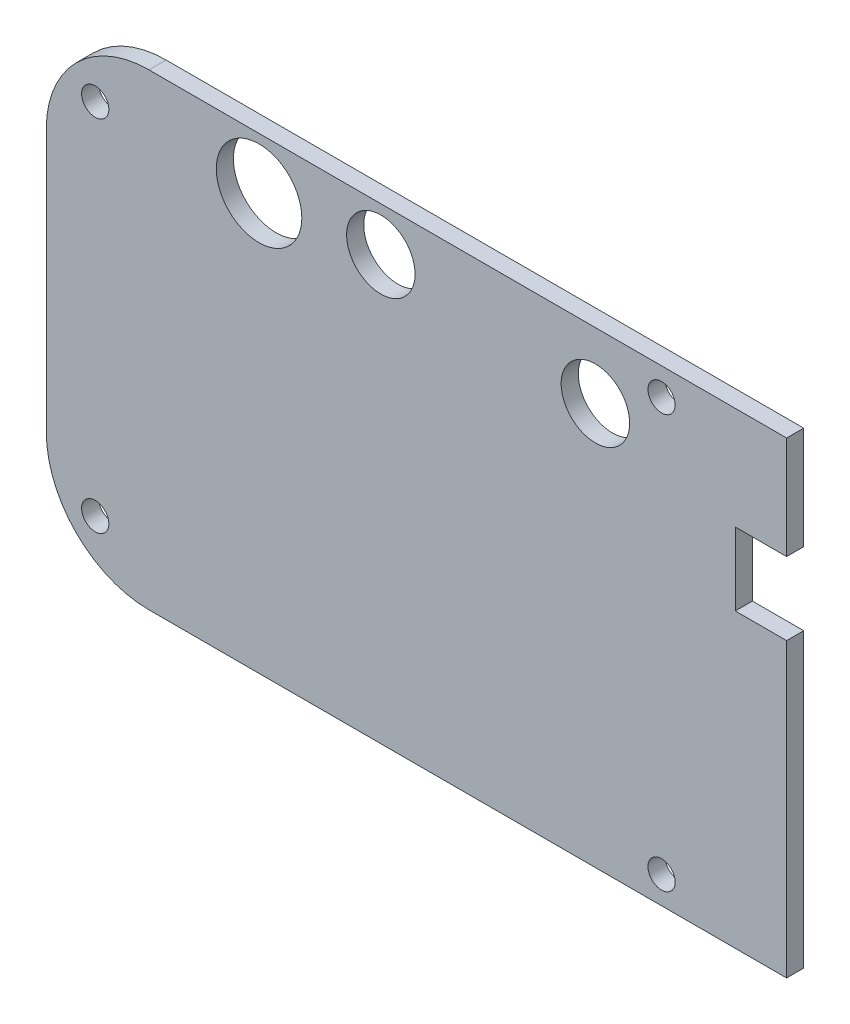
ISO-10303-21;
HEADER;
FILE_DESCRIPTION(('STEP AP214'),'2;1');
FILE_NAME('part.step','',(''),(''),'','','');
FILE_SCHEMA(('AUTOMOTIVE_DESIGN { 1 0 10303 214 1 1 1 1 }'));
ENDSEC;
DATA;
#1=APPLICATION_CONTEXT('core data for automotive mechanical design processes');
#2=APPLICATION_PROTOCOL_DEFINITION('international standard','automotive_design',2000,#1);
#3=PRODUCT_CONTEXT('',#1,'mechanical');
#4=PRODUCT('Part','Part','',(#3));
#5=PRODUCT_RELATED_PRODUCT_CATEGORY('part','',(#4));
#6=PRODUCT_DEFINITION_FORMATION('','',#4);
#7=PRODUCT_DEFINITION_CONTEXT('part definition',#1,'design');
#8=PRODUCT_DEFINITION('design','',#6,#7);
#9=PRODUCT_DEFINITION_SHAPE('','',#8);
#10=(LENGTH_UNIT() NAMED_UNIT(*) SI_UNIT(.MILLI.,.METRE.));
#11=(NAMED_UNIT(*) PLANE_ANGLE_UNIT() SI_UNIT($,.RADIAN.));
#12=(NAMED_UNIT(*) SI_UNIT($,.STERADIAN.) SOLID_ANGLE_UNIT());
#13=UNCERTAINTY_MEASURE_WITH_UNIT(LENGTH_MEASURE(1.E-05),#10,'distance_accuracy_value','');
#14=(GEOMETRIC_REPRESENTATION_CONTEXT(3) GLOBAL_UNCERTAINTY_ASSIGNED_CONTEXT((#13)) GLOBAL_UNIT_ASSIGNED_CONTEXT((#10,
#11,#12)) REPRESENTATION_CONTEXT('',''));
#15=CARTESIAN_POINT('',(0.,0.,0.));
#16=DIRECTION('',(0.,0.,1.));
#17=DIRECTION('',(1.,0.,0.));
#18=AXIS2_PLACEMENT_3D('',#15,#16,#17);
#19=CARTESIAN_POINT('',(86.5,0.,2.));
#20=DIRECTION('',(-1.,0.,0.));
#21=DIRECTION('',(0.,0.,1.));
#22=AXIS2_PLACEMENT_3D('',#19,#20,#21);
#23=PLANE('',#22);
#24=DIRECTION('',(0.,1.,0.));
#25=VECTOR('',#24,1.);
#26=CARTESIAN_POINT('',(86.5,0.,0.));
#27=LINE('',#26,#25);
#28=CARTESIAN_POINT('',(86.5,0.,0.));
#29=VERTEX_POINT('',#28);
#30=CARTESIAN_POINT('',(86.5,34.14,0.));
#31=VERTEX_POINT('',#30);
#32=EDGE_CURVE('E162',#29,#31,#27,.T.);
#33=ORIENTED_EDGE('',*,*,#32,.T.);
#34=DIRECTION('',(0.,0.,1.));
#35=VECTOR('',#34,1.);
#36=CARTESIAN_POINT('',(86.5,34.14,-8.));
#37=LINE('',#36,#35);
#38=CARTESIAN_POINT('',(86.5,34.14,2.));
#39=VERTEX_POINT('',#38);
#40=EDGE_CURVE('E251',#31,#39,#37,.T.);
#41=ORIENTED_EDGE('',*,*,#40,.T.);
#42=DIRECTION('',(0.,1.,0.));
#43=VECTOR('',#42,1.);
#44=CARTESIAN_POINT('',(86.5,0.,2.));
#45=LINE('',#44,#43);
#46=CARTESIAN_POINT('',(86.5,0.,2.));
#47=VERTEX_POINT('',#46);
#48=EDGE_CURVE('E145',#47,#39,#45,.T.);
#49=ORIENTED_EDGE('',*,*,#48,.F.);
#50=DIRECTION('',(0.,0.,-1.));
#51=VECTOR('',#50,1.);
#52=CARTESIAN_POINT('',(86.5,0.,2.));
#53=LINE('',#52,#51);
#54=EDGE_CURVE('E161',#47,#29,#53,.T.);
#55=ORIENTED_EDGE('',*,*,#54,.T.);
#56=EDGE_LOOP('',(#33,#41,#49,#55));
#57=FACE_BOUND('',#56,.T.);
#58=ADVANCED_FACE('F40',(#57),#23,.F.);
#59=CARTESIAN_POINT('',(86.5,42.64,2.));
#60=VERTEX_POINT('',#59);
#61=CARTESIAN_POINT('',(86.5,54.64,2.));
#62=VERTEX_POINT('',#61);
#63=EDGE_CURVE('E136',#60,#62,#45,.T.);
#64=ORIENTED_EDGE('',*,*,#63,.F.);
#65=DIRECTION('',(0.,0.,1.));
#66=VECTOR('',#65,1.);
#67=CARTESIAN_POINT('',(86.5,42.64,-8.));
#68=LINE('',#67,#66);
#69=CARTESIAN_POINT('',(86.5,42.64,0.));
#70=VERTEX_POINT('',#69);
#71=EDGE_CURVE('E119',#70,#60,#68,.T.);
#72=ORIENTED_EDGE('',*,*,#71,.F.);
#73=CARTESIAN_POINT('',(86.5,54.64,0.));
#74=VERTEX_POINT('',#73);
#75=EDGE_CURVE('E166',#70,#74,#27,.T.);
#76=ORIENTED_EDGE('',*,*,#75,.T.);
#77=DIRECTION('',(0.,0.,-1.));
#78=VECTOR('',#77,1.);
#79=CARTESIAN_POINT('',(86.5,54.64,2.));
#80=LINE('',#79,#78);
#81=EDGE_CURVE('E144',#62,#74,#80,.T.);
#82=ORIENTED_EDGE('',*,*,#81,.F.);
#83=EDGE_LOOP('',(#64,#72,#76,#82));
#84=FACE_BOUND('',#83,.T.);
#85=ADVANCED_FACE('F142',(#84),#23,.F.);
#86=CARTESIAN_POINT('',(86.5,54.64,2.));
#87=DIRECTION('',(0.,-1.,0.));
#88=DIRECTION('',(1.,0.,0.));
#89=AXIS2_PLACEMENT_3D('',#86,#87,#88);
#90=PLANE('',#89);
#91=DIRECTION('',(-1.,0.,0.));
#92=VECTOR('',#91,1.);
#93=CARTESIAN_POINT('',(86.5,54.64,0.));
#94=LINE('',#93,#92);
#95=CARTESIAN_POINT('',(12.,54.64,0.));
#96=VERTEX_POINT('',#95);
#97=EDGE_CURVE('E165',#74,#96,#94,.T.);
#98=ORIENTED_EDGE('',*,*,#97,.T.);
#99=DIRECTION('',(0.,0.,-1.));
#100=VECTOR('',#99,1.);
#101=CARTESIAN_POINT('',(12.,54.64,2.));
#102=LINE('',#101,#100);
#103=CARTESIAN_POINT('',(12.,54.64,2.));
#104=VERTEX_POINT('',#103);
#105=EDGE_CURVE('E178',#96,#104,#102,.F.);
#106=ORIENTED_EDGE('',*,*,#105,.T.);
#107=DIRECTION('',(-1.,0.,0.));
#108=VECTOR('',#107,1.);
#109=CARTESIAN_POINT('',(86.5,54.64,2.));
#110=LINE('',#109,#108);
#111=EDGE_CURVE('E149',#62,#104,#110,.T.);
#112=ORIENTED_EDGE('',*,*,#111,.F.);
#113=ORIENTED_EDGE('',*,*,#81,.T.);
#114=EDGE_LOOP('',(#98,#106,#112,#113));
#115=FACE_BOUND('',#114,.T.);
#116=ADVANCED_FACE('F300',(#115),#90,.F.);
#117=CARTESIAN_POINT('',(0.,54.64,2.));
#118=DIRECTION('',(1.,0.,0.));
#119=DIRECTION('',(0.,0.,-1.));
#120=AXIS2_PLACEMENT_3D('',#117,#118,#119);
#121=PLANE('',#120);
#122=DIRECTION('',(0.,-1.,0.));
#123=VECTOR('',#122,1.);
#124=CARTESIAN_POINT('',(0.,54.64,0.));
#125=LINE('',#124,#123);
#126=CARTESIAN_POINT('',(0.,42.64,0.));
#127=VERTEX_POINT('',#126);
#128=CARTESIAN_POINT('',(0.,12.,0.));
#129=VERTEX_POINT('',#128);
#130=EDGE_CURVE('E150',#127,#129,#125,.T.);
#131=ORIENTED_EDGE('',*,*,#130,.T.);
#132=DIRECTION('',(0.,0.,-1.));
#133=VECTOR('',#132,1.);
#134=CARTESIAN_POINT('',(0.,12.,2.));
#135=LINE('',#134,#133);
#136=CARTESIAN_POINT('',(0.,12.,2.));
#137=VERTEX_POINT('',#136);
#138=EDGE_CURVE('E65',#129,#137,#135,.F.);
#139=ORIENTED_EDGE('',*,*,#138,.T.);
#140=DIRECTION('',(0.,-1.,0.));
#141=VECTOR('',#140,1.);
#142=CARTESIAN_POINT('',(0.,54.64,2.));
#143=LINE('',#142,#141);
#144=CARTESIAN_POINT('',(0.,42.64,2.));
#145=VERTEX_POINT('',#144);
#146=EDGE_CURVE('E157',#145,#137,#143,.T.);
#147=ORIENTED_EDGE('',*,*,#146,.F.);
#148=DIRECTION('',(0.,0.,-1.));
#149=VECTOR('',#148,1.);
#150=CARTESIAN_POINT('',(0.,42.64,2.));
#151=LINE('',#150,#149);
#152=EDGE_CURVE('E173',#145,#127,#151,.T.);
#153=ORIENTED_EDGE('',*,*,#152,.T.);
#154=EDGE_LOOP('',(#131,#139,#147,#153));
#155=FACE_BOUND('',#154,.T.);
#156=ADVANCED_FACE('F319',(#155),#121,.F.);
#157=CARTESIAN_POINT('',(0.,0.,2.));
#158=DIRECTION('',(0.,1.,0.));
#159=DIRECTION('',(0.,0.,1.));
#160=AXIS2_PLACEMENT_3D('',#157,#158,#159);
#161=PLANE('',#160);
#162=DIRECTION('',(1.,0.,0.));
#163=VECTOR('',#162,1.);
#164=CARTESIAN_POINT('',(0.,0.,2.));
#165=LINE('',#164,#163);
#166=CARTESIAN_POINT('',(12.,0.,2.));
#167=VERTEX_POINT('',#166);
#168=EDGE_CURVE('E159',#167,#47,#165,.T.);
#169=ORIENTED_EDGE('',*,*,#168,.F.);
#170=DIRECTION('',(0.,0.,-1.));
#171=VECTOR('',#170,1.);
#172=CARTESIAN_POINT('',(12.,0.,2.));
#173=LINE('',#172,#171);
#174=CARTESIAN_POINT('',(12.,0.,0.));
#175=VERTEX_POINT('',#174);
#176=EDGE_CURVE('E182',#167,#175,#173,.T.);
#177=ORIENTED_EDGE('',*,*,#176,.T.);
#178=DIRECTION('',(1.,0.,0.));
#179=VECTOR('',#178,1.);
#180=CARTESIAN_POINT('',(0.,0.,0.));
#181=LINE('',#180,#179);
#182=EDGE_CURVE('E146',#175,#29,#181,.T.);
#183=ORIENTED_EDGE('',*,*,#182,.T.);
#184=ORIENTED_EDGE('',*,*,#54,.F.);
#185=EDGE_LOOP('',(#169,#177,#183,#184));
#186=FACE_BOUND('',#185,.T.);
#187=ADVANCED_FACE('F272',(#186),#161,.F.);
#188=CARTESIAN_POINT('',(0.,0.,2.));
#189=DIRECTION('',(0.,0.,1.));
#190=DIRECTION('',(1.,0.,0.));
#191=AXIS2_PLACEMENT_3D('',#188,#189,#190);
#192=PLANE('',#191);
#193=CARTESIAN_POINT('',(24.86,48.58,2.));
#194=DIRECTION('',(0.,0.,1.));
#195=DIRECTION('',(1.,0.,0.));
#196=AXIS2_PLACEMENT_3D('',#193,#194,#195);
#197=CIRCLE('',#196,5.);
#198=CARTESIAN_POINT('',(29.86,48.58,2.));
#199=VERTEX_POINT('',#198);
#200=EDGE_CURVE('E196',#199,#199,#197,.T.);
#201=ORIENTED_EDGE('',*,*,#200,.F.);
#202=EDGE_LOOP('',(#201));
#203=FACE_BOUND('',#202,.T.);
#204=CARTESIAN_POINT('',(39.09,49.5,2.));
#205=DIRECTION('',(0.,0.,1.));
#206=DIRECTION('',(1.,0.,0.));
#207=AXIS2_PLACEMENT_3D('',#204,#205,#206);
#208=CIRCLE('',#207,4.00000000000001);
#209=CARTESIAN_POINT('',(43.09,49.5,2.));
#210=VERTEX_POINT('',#209);
#211=EDGE_CURVE('E261',#210,#210,#208,.T.);
#212=ORIENTED_EDGE('',*,*,#211,.F.);
#213=EDGE_LOOP('',(#212));
#214=FACE_BOUND('',#213,.T.);
#215=CARTESIAN_POINT('',(64.16,46.97,2.));
#216=DIRECTION('',(0.,0.,1.));
#217=DIRECTION('',(1.,0.,0.));
#218=AXIS2_PLACEMENT_3D('',#215,#216,#217);
#219=CIRCLE('',#218,4.00000000000001);
#220=CARTESIAN_POINT('',(68.16,46.97,2.));
#221=VERTEX_POINT('',#220);
#222=EDGE_CURVE('E254',#221,#221,#219,.T.);
#223=ORIENTED_EDGE('',*,*,#222,.F.);
#224=EDGE_LOOP('',(#223));
#225=FACE_BOUND('',#224,.T.);
#226=DIRECTION('',(1.,0.,0.));
#227=VECTOR('',#226,1.);
#228=CARTESIAN_POINT('',(80.5,34.14,2.));
#229=LINE('',#228,#227);
#230=CARTESIAN_POINT('',(80.5,34.14,2.));
#231=VERTEX_POINT('',#230);
#232=EDGE_CURVE('E129',#231,#39,#229,.T.);
#233=ORIENTED_EDGE('',*,*,#232,.F.);
#234=DIRECTION('',(0.,-1.,0.));
#235=VECTOR('',#234,1.);
#236=CARTESIAN_POINT('',(80.5,42.64,2.));
#237=LINE('',#236,#235);
#238=CARTESIAN_POINT('',(80.5,42.64,2.));
#239=VERTEX_POINT('',#238);
#240=EDGE_CURVE('E139',#239,#231,#237,.T.);
#241=ORIENTED_EDGE('',*,*,#240,.F.);
#242=DIRECTION('',(-1.,0.,0.));
#243=VECTOR('',#242,1.);
#244=CARTESIAN_POINT('',(86.5,42.64,2.));
#245=LINE('',#244,#243);
#246=EDGE_CURVE('E122',#60,#239,#245,.T.);
#247=ORIENTED_EDGE('',*,*,#246,.F.);
#248=ORIENTED_EDGE('',*,*,#63,.T.);
#249=ORIENTED_EDGE('',*,*,#111,.T.);
#250=CARTESIAN_POINT('',(12.,42.64,2.));
#251=DIRECTION('',(0.,0.,1.));
#252=DIRECTION('',(1.,0.,0.));
#253=AXIS2_PLACEMENT_3D('',#250,#251,#252);
#254=CIRCLE('',#253,12.);
#255=EDGE_CURVE('E180',#104,#145,#254,.T.);
#256=ORIENTED_EDGE('',*,*,#255,.T.);
#257=ORIENTED_EDGE('',*,*,#146,.T.);
#258=CARTESIAN_POINT('',(12.,12.,2.));
#259=DIRECTION('',(0.,0.,1.));
#260=DIRECTION('',(1.,0.,0.));
#261=AXIS2_PLACEMENT_3D('',#258,#259,#260);
#262=CIRCLE('',#261,12.);
#263=EDGE_CURVE('E188',#137,#167,#262,.T.);
#264=ORIENTED_EDGE('',*,*,#263,.T.);
#265=ORIENTED_EDGE('',*,*,#168,.T.);
#266=ORIENTED_EDGE('',*,*,#48,.T.);
#267=EDGE_LOOP('',(#233,#241,#247,#248,#249,#256,#257,#264,#265,#266));
#268=FACE_BOUND('',#267,.T.);
#269=CARTESIAN_POINT('',(5.72,48.29,2.));
#270=DIRECTION('',(0.,0.,-1.));
#271=DIRECTION('',(-1.,0.,0.));
#272=AXIS2_PLACEMENT_3D('',#269,#270,#271);
#273=CIRCLE('',#272,1.59);
#274=CARTESIAN_POINT('',(4.13,48.29,2.));
#275=VERTEX_POINT('',#274);
#276=EDGE_CURVE('E205',#275,#275,#273,.T.);
#277=ORIENTED_EDGE('',*,*,#276,.T.);
#278=EDGE_LOOP('',(#277));
#279=FACE_BOUND('',#278,.T.);
#280=CARTESIAN_POINT('',(5.72,6.35,2.));
#281=DIRECTION('',(0.,0.,-1.));
#282=DIRECTION('',(-1.,0.,0.));
#283=AXIS2_PLACEMENT_3D('',#280,#281,#282);
#284=CIRCLE('',#283,1.59);
#285=CARTESIAN_POINT('',(4.13,6.35,2.));
#286=VERTEX_POINT('',#285);
#287=EDGE_CURVE('E227',#286,#286,#284,.T.);
#288=ORIENTED_EDGE('',*,*,#287,.T.);
#289=EDGE_LOOP('',(#288));
#290=FACE_BOUND('',#289,.T.);
#291=CARTESIAN_POINT('',(71.89,3.18,2.));
#292=DIRECTION('',(0.,0.,-1.));
#293=DIRECTION('',(-1.,0.,0.));
#294=AXIS2_PLACEMENT_3D('',#291,#292,#293);
#295=CIRCLE('',#294,1.58999999999999);
#296=CARTESIAN_POINT('',(70.3,3.18,2.));
#297=VERTEX_POINT('',#296);
#298=EDGE_CURVE('E218',#297,#297,#295,.T.);
#299=ORIENTED_EDGE('',*,*,#298,.T.);
#300=EDGE_LOOP('',(#299));
#301=FACE_BOUND('',#300,.T.);
#302=CARTESIAN_POINT('',(71.89,51.46,2.));
#303=DIRECTION('',(0.,0.,-1.));
#304=DIRECTION('',(-1.,0.,0.));
#305=AXIS2_PLACEMENT_3D('',#302,#303,#304);
#306=CIRCLE('',#305,1.58999999999999);
#307=CARTESIAN_POINT('',(70.3,51.46,2.));
#308=VERTEX_POINT('',#307);
#309=EDGE_CURVE('E213',#308,#308,#306,.T.);
#310=ORIENTED_EDGE('',*,*,#309,.T.);
#311=EDGE_LOOP('',(#310));
#312=FACE_BOUND('',#311,.T.);
#313=ADVANCED_FACE('F133',(#203,#214,#225,#268,#279,#290,#301,#312),#192,.T.);
#314=CARTESIAN_POINT('',(0.,0.,0.));
#315=DIRECTION('',(0.,0.,1.));
#316=DIRECTION('',(1.,0.,0.));
#317=AXIS2_PLACEMENT_3D('',#314,#315,#316);
#318=PLANE('',#317);
#319=CARTESIAN_POINT('',(24.86,48.58,0.));
#320=DIRECTION('',(0.,0.,1.));
#321=DIRECTION('',(1.,0.,0.));
#322=AXIS2_PLACEMENT_3D('',#319,#320,#321);
#323=CIRCLE('',#322,5.);
#324=CARTESIAN_POINT('',(29.86,48.58,0.));
#325=VERTEX_POINT('',#324);
#326=EDGE_CURVE('E44',#325,#325,#323,.T.);
#327=ORIENTED_EDGE('',*,*,#326,.T.);
#328=EDGE_LOOP('',(#327));
#329=FACE_BOUND('',#328,.T.);
#330=CARTESIAN_POINT('',(39.09,49.5,0.));
#331=DIRECTION('',(0.,0.,1.));
#332=DIRECTION('',(1.,0.,0.));
#333=AXIS2_PLACEMENT_3D('',#330,#331,#332);
#334=CIRCLE('',#333,4.00000000000001);
#335=CARTESIAN_POINT('',(43.09,49.5,0.));
#336=VERTEX_POINT('',#335);
#337=EDGE_CURVE('E195',#336,#336,#334,.T.);
#338=ORIENTED_EDGE('',*,*,#337,.T.);
#339=EDGE_LOOP('',(#338));
#340=FACE_BOUND('',#339,.T.);
#341=CARTESIAN_POINT('',(64.16,46.97,0.));
#342=DIRECTION('',(0.,0.,1.));
#343=DIRECTION('',(1.,0.,0.));
#344=AXIS2_PLACEMENT_3D('',#341,#342,#343);
#345=CIRCLE('',#344,4.00000000000001);
#346=CARTESIAN_POINT('',(68.16,46.97,0.));
#347=VERTEX_POINT('',#346);
#348=EDGE_CURVE('E193',#347,#347,#345,.T.);
#349=ORIENTED_EDGE('',*,*,#348,.T.);
#350=EDGE_LOOP('',(#349));
#351=FACE_BOUND('',#350,.T.);
#352=CARTESIAN_POINT('',(5.72,48.29,0.));
#353=DIRECTION('',(0.,0.,-1.));
#354=DIRECTION('',(-1.,0.,0.));
#355=AXIS2_PLACEMENT_3D('',#352,#353,#354);
#356=CIRCLE('',#355,1.59);
#357=CARTESIAN_POINT('',(4.13,48.29,0.));
#358=VERTEX_POINT('',#357);
#359=EDGE_CURVE('E201',#358,#358,#356,.T.);
#360=ORIENTED_EDGE('',*,*,#359,.F.);
#361=EDGE_LOOP('',(#360));
#362=FACE_BOUND('',#361,.T.);
#363=CARTESIAN_POINT('',(5.72,6.35,0.));
#364=DIRECTION('',(0.,0.,-1.));
#365=DIRECTION('',(-1.,0.,0.));
#366=AXIS2_PLACEMENT_3D('',#363,#364,#365);
#367=CIRCLE('',#366,1.59);
#368=CARTESIAN_POINT('',(4.13,6.35,0.));
#369=VERTEX_POINT('',#368);
#370=EDGE_CURVE('E210',#369,#369,#367,.T.);
#371=ORIENTED_EDGE('',*,*,#370,.F.);
#372=EDGE_LOOP('',(#371));
#373=FACE_BOUND('',#372,.T.);
#374=CARTESIAN_POINT('',(71.89,3.18,0.));
#375=DIRECTION('',(0.,0.,-1.));
#376=DIRECTION('',(-1.,0.,0.));
#377=AXIS2_PLACEMENT_3D('',#374,#375,#376);
#378=CIRCLE('',#377,1.58999999999999);
#379=CARTESIAN_POINT('',(70.3,3.18,0.));
#380=VERTEX_POINT('',#379);
#381=EDGE_CURVE('E222',#380,#380,#378,.T.);
#382=ORIENTED_EDGE('',*,*,#381,.F.);
#383=EDGE_LOOP('',(#382));
#384=FACE_BOUND('',#383,.T.);
#385=CARTESIAN_POINT('',(71.89,51.46,0.));
#386=DIRECTION('',(0.,0.,-1.));
#387=DIRECTION('',(-1.,0.,0.));
#388=AXIS2_PLACEMENT_3D('',#385,#386,#387);
#389=CIRCLE('',#388,1.58999999999999);
#390=CARTESIAN_POINT('',(70.3,51.46,0.));
#391=VERTEX_POINT('',#390);
#392=EDGE_CURVE('E154',#391,#391,#389,.T.);
#393=ORIENTED_EDGE('',*,*,#392,.F.);
#394=EDGE_LOOP('',(#393));
#395=FACE_BOUND('',#394,.T.);
#396=DIRECTION('',(0.,-1.,0.));
#397=VECTOR('',#396,1.);
#398=CARTESIAN_POINT('',(80.5,0.,0.));
#399=LINE('',#398,#397);
#400=CARTESIAN_POINT('',(80.5,42.64,0.));
#401=VERTEX_POINT('',#400);
#402=CARTESIAN_POINT('',(80.5,34.14,0.));
#403=VERTEX_POINT('',#402);
#404=EDGE_CURVE('E49',#401,#403,#399,.T.);
#405=ORIENTED_EDGE('',*,*,#404,.T.);
#406=DIRECTION('',(1.,0.,0.));
#407=VECTOR('',#406,1.);
#408=CARTESIAN_POINT('',(0.,34.14,0.));
#409=LINE('',#408,#407);
#410=EDGE_CURVE('E11',#403,#31,#409,.T.);
#411=ORIENTED_EDGE('',*,*,#410,.T.);
#412=ORIENTED_EDGE('',*,*,#32,.F.);
#413=ORIENTED_EDGE('',*,*,#182,.F.);
#414=CARTESIAN_POINT('',(12.,12.,0.));
#415=DIRECTION('',(0.,0.,1.));
#416=DIRECTION('',(1.,0.,0.));
#417=AXIS2_PLACEMENT_3D('',#414,#415,#416);
#418=CIRCLE('',#417,12.);
#419=EDGE_CURVE('E185',#175,#129,#418,.F.);
#420=ORIENTED_EDGE('',*,*,#419,.T.);
#421=ORIENTED_EDGE('',*,*,#130,.F.);
#422=CARTESIAN_POINT('',(12.,42.64,0.));
#423=DIRECTION('',(0.,0.,1.));
#424=DIRECTION('',(1.,0.,0.));
#425=AXIS2_PLACEMENT_3D('',#422,#423,#424);
#426=CIRCLE('',#425,12.);
#427=EDGE_CURVE('E176',#127,#96,#426,.F.);
#428=ORIENTED_EDGE('',*,*,#427,.T.);
#429=ORIENTED_EDGE('',*,*,#97,.F.);
#430=ORIENTED_EDGE('',*,*,#75,.F.);
#431=DIRECTION('',(-1.,0.,0.));
#432=VECTOR('',#431,1.);
#433=CARTESIAN_POINT('',(0.,42.64,0.));
#434=LINE('',#433,#432);
#435=EDGE_CURVE('E125',#70,#401,#434,.T.);
#436=ORIENTED_EDGE('',*,*,#435,.T.);
#437=EDGE_LOOP('',(#405,#411,#412,#413,#420,#421,#428,#429,#430,#436));
#438=FACE_BOUND('',#437,.T.);
#439=ADVANCED_FACE('F237',(#329,#340,#351,#362,#373,#384,#395,#438),#318,.F.);
#440=CARTESIAN_POINT('',(71.89,51.46,2.));
#441=DIRECTION('',(0.,0.,-1.));
#442=DIRECTION('',(-1.,0.,0.));
#443=AXIS2_PLACEMENT_3D('',#440,#441,#442);
#444=CYLINDRICAL_SURFACE('',#443,1.58999999999999);
#445=ORIENTED_EDGE('',*,*,#309,.F.);
#446=EDGE_LOOP('',(#445));
#447=FACE_BOUND('',#446,.T.);
#448=ORIENTED_EDGE('',*,*,#392,.T.);
#449=EDGE_LOOP('',(#448));
#450=FACE_BOUND('',#449,.T.);
#451=ADVANCED_FACE('F240',(#447,#450),#444,.F.);
#452=CARTESIAN_POINT('',(71.89,3.18,2.));
#453=DIRECTION('',(0.,0.,-1.));
#454=DIRECTION('',(-1.,0.,0.));
#455=AXIS2_PLACEMENT_3D('',#452,#453,#454);
#456=CYLINDRICAL_SURFACE('',#455,1.58999999999999);
#457=ORIENTED_EDGE('',*,*,#298,.F.);
#458=EDGE_LOOP('',(#457));
#459=FACE_BOUND('',#458,.T.);
#460=ORIENTED_EDGE('',*,*,#381,.T.);
#461=EDGE_LOOP('',(#460));
#462=FACE_BOUND('',#461,.T.);
#463=ADVANCED_FACE('F334',(#459,#462),#456,.F.);
#464=CARTESIAN_POINT('',(5.72,6.35,2.));
#465=DIRECTION('',(0.,0.,-1.));
#466=DIRECTION('',(-1.,0.,0.));
#467=AXIS2_PLACEMENT_3D('',#464,#465,#466);
#468=CYLINDRICAL_SURFACE('',#467,1.59);
#469=ORIENTED_EDGE('',*,*,#287,.F.);
#470=EDGE_LOOP('',(#469));
#471=FACE_BOUND('',#470,.T.);
#472=ORIENTED_EDGE('',*,*,#370,.T.);
#473=EDGE_LOOP('',(#472));
#474=FACE_BOUND('',#473,.T.);
#475=ADVANCED_FACE('F235',(#471,#474),#468,.F.);
#476=CARTESIAN_POINT('',(5.72,48.29,2.));
#477=DIRECTION('',(0.,0.,-1.));
#478=DIRECTION('',(-1.,0.,0.));
#479=AXIS2_PLACEMENT_3D('',#476,#477,#478);
#480=CYLINDRICAL_SURFACE('',#479,1.59);
#481=ORIENTED_EDGE('',*,*,#276,.F.);
#482=EDGE_LOOP('',(#481));
#483=FACE_BOUND('',#482,.T.);
#484=ORIENTED_EDGE('',*,*,#359,.T.);
#485=EDGE_LOOP('',(#484));
#486=FACE_BOUND('',#485,.T.);
#487=ADVANCED_FACE('F305',(#483,#486),#480,.F.);
#488=CARTESIAN_POINT('',(12.,42.64,2.));
#489=DIRECTION('',(0.,0.,-1.));
#490=DIRECTION('',(-1.,0.,0.));
#491=AXIS2_PLACEMENT_3D('',#488,#489,#490);
#492=CYLINDRICAL_SURFACE('',#491,12.);
#493=ORIENTED_EDGE('',*,*,#255,.F.);
#494=ORIENTED_EDGE('',*,*,#105,.F.);
#495=ORIENTED_EDGE('',*,*,#427,.F.);
#496=ORIENTED_EDGE('',*,*,#152,.F.);
#497=EDGE_LOOP('',(#493,#494,#495,#496));
#498=FACE_BOUND('',#497,.T.);
#499=ADVANCED_FACE('F303',(#498),#492,.T.);
#500=CARTESIAN_POINT('',(12.,12.,2.));
#501=DIRECTION('',(0.,0.,-1.));
#502=DIRECTION('',(-1.,0.,0.));
#503=AXIS2_PLACEMENT_3D('',#500,#501,#502);
#504=CYLINDRICAL_SURFACE('',#503,12.);
#505=ORIENTED_EDGE('',*,*,#263,.F.);
#506=ORIENTED_EDGE('',*,*,#138,.F.);
#507=ORIENTED_EDGE('',*,*,#419,.F.);
#508=ORIENTED_EDGE('',*,*,#176,.F.);
#509=EDGE_LOOP('',(#505,#506,#507,#508));
#510=FACE_BOUND('',#509,.T.);
#511=ADVANCED_FACE('F42',(#510),#504,.T.);
#512=CARTESIAN_POINT('',(80.5,34.14,-8.));
#513=DIRECTION('',(0.,-1.,0.));
#514=DIRECTION('',(0.,0.,-1.));
#515=AXIS2_PLACEMENT_3D('',#512,#513,#514);
#516=PLANE('',#515);
#517=DIRECTION('',(0.,0.,1.));
#518=VECTOR('',#517,1.);
#519=CARTESIAN_POINT('',(80.5,34.14,-8.));
#520=LINE('',#519,#518);
#521=EDGE_CURVE('E249',#403,#231,#520,.T.);
#522=ORIENTED_EDGE('',*,*,#521,.T.);
#523=ORIENTED_EDGE('',*,*,#232,.T.);
#524=ORIENTED_EDGE('',*,*,#40,.F.);
#525=ORIENTED_EDGE('',*,*,#410,.F.);
#526=EDGE_LOOP('',(#522,#523,#524,#525));
#527=FACE_BOUND('',#526,.T.);
#528=ADVANCED_FACE('F311',(#527),#516,.F.);
#529=CARTESIAN_POINT('',(80.5,42.64,-8.));
#530=DIRECTION('',(-1.,0.,0.));
#531=DIRECTION('',(0.,0.,1.));
#532=AXIS2_PLACEMENT_3D('',#529,#530,#531);
#533=PLANE('',#532);
#534=DIRECTION('',(0.,0.,1.));
#535=VECTOR('',#534,1.);
#536=CARTESIAN_POINT('',(80.5,42.64,-8.));
#537=LINE('',#536,#535);
#538=EDGE_CURVE('E57',#401,#239,#537,.T.);
#539=ORIENTED_EDGE('',*,*,#538,.T.);
#540=ORIENTED_EDGE('',*,*,#240,.T.);
#541=ORIENTED_EDGE('',*,*,#521,.F.);
#542=ORIENTED_EDGE('',*,*,#404,.F.);
#543=EDGE_LOOP('',(#539,#540,#541,#542));
#544=FACE_BOUND('',#543,.T.);
#545=ADVANCED_FACE('F248',(#544),#533,.F.);
#546=CARTESIAN_POINT('',(86.5,42.64,-8.));
#547=DIRECTION('',(0.,1.,0.));
#548=DIRECTION('',(0.,0.,1.));
#549=AXIS2_PLACEMENT_3D('',#546,#547,#548);
#550=PLANE('',#549);
#551=ORIENTED_EDGE('',*,*,#71,.T.);
#552=ORIENTED_EDGE('',*,*,#246,.T.);
#553=ORIENTED_EDGE('',*,*,#538,.F.);
#554=ORIENTED_EDGE('',*,*,#435,.F.);
#555=EDGE_LOOP('',(#551,#552,#553,#554));
#556=FACE_BOUND('',#555,.T.);
#557=ADVANCED_FACE('F121',(#556),#550,.F.);
#558=CARTESIAN_POINT('',(64.16,46.97,-8.));
#559=DIRECTION('',(0.,0.,1.));
#560=DIRECTION('',(1.,0.,0.));
#561=AXIS2_PLACEMENT_3D('',#558,#559,#560);
#562=CYLINDRICAL_SURFACE('',#561,4.00000000000001);
#563=ORIENTED_EDGE('',*,*,#222,.T.);
#564=EDGE_LOOP('',(#563));
#565=FACE_BOUND('',#564,.T.);
#566=ORIENTED_EDGE('',*,*,#348,.F.);
#567=EDGE_LOOP('',(#566));
#568=FACE_BOUND('',#567,.T.);
#569=ADVANCED_FACE('F278',(#565,#568),#562,.F.);
#570=CARTESIAN_POINT('',(39.09,49.5,-8.));
#571=DIRECTION('',(0.,0.,1.));
#572=DIRECTION('',(1.,0.,0.));
#573=AXIS2_PLACEMENT_3D('',#570,#571,#572);
#574=CYLINDRICAL_SURFACE('',#573,4.00000000000001);
#575=ORIENTED_EDGE('',*,*,#211,.T.);
#576=EDGE_LOOP('',(#575));
#577=FACE_BOUND('',#576,.T.);
#578=ORIENTED_EDGE('',*,*,#337,.F.);
#579=EDGE_LOOP('',(#578));
#580=FACE_BOUND('',#579,.T.);
#581=ADVANCED_FACE('F281',(#577,#580),#574,.F.);
#582=CARTESIAN_POINT('',(24.86,48.58,-8.));
#583=DIRECTION('',(0.,0.,1.));
#584=DIRECTION('',(1.,0.,0.));
#585=AXIS2_PLACEMENT_3D('',#582,#583,#584);
#586=CYLINDRICAL_SURFACE('',#585,5.);
#587=ORIENTED_EDGE('',*,*,#200,.T.);
#588=EDGE_LOOP('',(#587));
#589=FACE_BOUND('',#588,.T.);
#590=ORIENTED_EDGE('',*,*,#326,.F.);
#591=EDGE_LOOP('',(#590));
#592=FACE_BOUND('',#591,.T.);
#593=ADVANCED_FACE('F267',(#589,#592),#586,.F.);
#594=CLOSED_SHELL('',(#58,#85,#116,#156,#187,#313,#439,#451,#463,#475,#487,#499,#511,#528,#545,
#557,#569,#581,#593));
#595=MANIFOLD_SOLID_BREP('B2',#594);
#596=ADVANCED_BREP_SHAPE_REPRESENTATION('',(#18,#595),#14);
#597=SHAPE_DEFINITION_REPRESENTATION(#9,#596);
ENDSEC;
END-ISO-10303-21;
